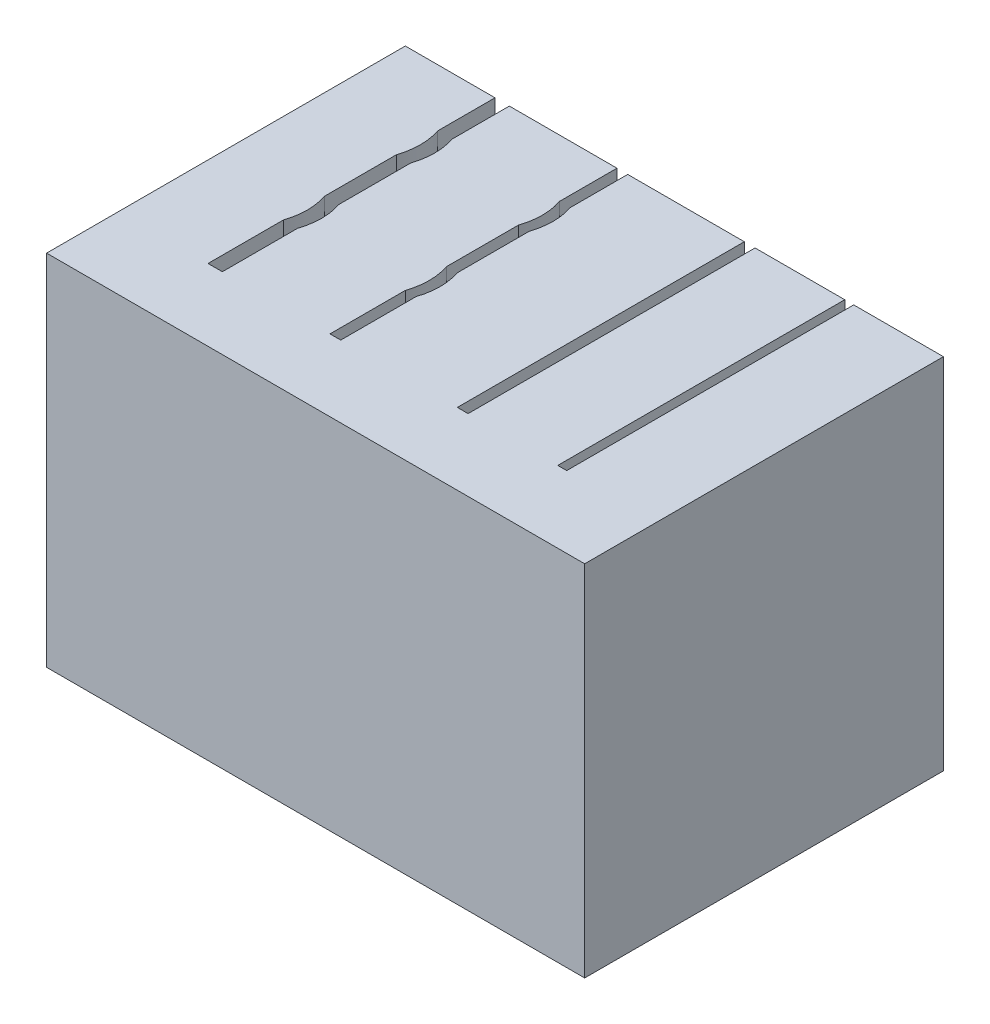
ISO-10303-21;
HEADER;
FILE_DESCRIPTION(('STEP AP214'),'2;1');
FILE_NAME('part.step','',(''),(''),'','','');
FILE_SCHEMA(('AUTOMOTIVE_DESIGN { 1 0 10303 214 1 1 1 1 }'));
ENDSEC;
DATA;
#1=APPLICATION_CONTEXT('core data for automotive mechanical design processes');
#2=APPLICATION_PROTOCOL_DEFINITION('international standard','automotive_design',2000,#1);
#3=PRODUCT_CONTEXT('',#1,'mechanical');
#4=PRODUCT('Part','Part','',(#3));
#5=PRODUCT_RELATED_PRODUCT_CATEGORY('part','',(#4));
#6=PRODUCT_DEFINITION_FORMATION('','',#4);
#7=PRODUCT_DEFINITION_CONTEXT('part definition',#1,'design');
#8=PRODUCT_DEFINITION('design','',#6,#7);
#9=PRODUCT_DEFINITION_SHAPE('','',#8);
#10=(LENGTH_UNIT() NAMED_UNIT(*) SI_UNIT(.MILLI.,.METRE.));
#11=(NAMED_UNIT(*) PLANE_ANGLE_UNIT() SI_UNIT($,.RADIAN.));
#12=(NAMED_UNIT(*) SI_UNIT($,.STERADIAN.) SOLID_ANGLE_UNIT());
#13=UNCERTAINTY_MEASURE_WITH_UNIT(LENGTH_MEASURE(1.E-05),#10,'distance_accuracy_value','');
#14=(GEOMETRIC_REPRESENTATION_CONTEXT(3) GLOBAL_UNCERTAINTY_ASSIGNED_CONTEXT((#13)) GLOBAL_UNIT_ASSIGNED_CONTEXT((#10,
#11,#12)) REPRESENTATION_CONTEXT('',''));
#15=CARTESIAN_POINT('',(0.,0.,0.));
#16=DIRECTION('',(0.,0.,1.));
#17=DIRECTION('',(1.,0.,0.));
#18=AXIS2_PLACEMENT_3D('',#15,#16,#17);
#19=CARTESIAN_POINT('',(-1.3,5.,-5.));
#20=DIRECTION('',(1.,0.,0.));
#21=DIRECTION('',(0.,0.,-1.));
#22=AXIS2_PLACEMENT_3D('',#19,#20,#21);
#23=PLANE('',#22);
#24=DIRECTION('',(0.,0.,-1.));
#25=VECTOR('',#24,1.);
#26=CARTESIAN_POINT('',(-1.3,5.,-5.));
#27=LINE('',#26,#25);
#28=CARTESIAN_POINT('',(-1.3,5.,-3.4));
#29=VERTEX_POINT('',#28);
#30=CARTESIAN_POINT('',(-1.3,5.,-5.));
#31=VERTEX_POINT('',#30);
#32=EDGE_CURVE('E293',#29,#31,#27,.T.);
#33=ORIENTED_EDGE('',*,*,#32,.F.);
#34=DIRECTION('',(0.,1.,0.));
#35=VECTOR('',#34,1.);
#36=CARTESIAN_POINT('',(-1.3,3.84613927930172,-3.4));
#37=LINE('',#36,#35);
#38=CARTESIAN_POINT('',(-1.3,10.,-3.4));
#39=VERTEX_POINT('',#38);
#40=EDGE_CURVE('E54',#29,#39,#37,.T.);
#41=ORIENTED_EDGE('',*,*,#40,.T.);
#42=DIRECTION('',(0.,0.,-1.));
#43=VECTOR('',#42,1.);
#44=CARTESIAN_POINT('',(-1.3,10.,-5.));
#45=LINE('',#44,#43);
#46=CARTESIAN_POINT('',(-1.3,10.,-5.));
#47=VERTEX_POINT('',#46);
#48=EDGE_CURVE('E318',#39,#47,#45,.T.);
#49=ORIENTED_EDGE('',*,*,#48,.T.);
#50=DIRECTION('',(0.,1.,0.));
#51=VECTOR('',#50,1.);
#52=CARTESIAN_POINT('',(-1.3,5.,-5.));
#53=LINE('',#52,#51);
#54=EDGE_CURVE('E321',#31,#47,#53,.T.);
#55=ORIENTED_EDGE('',*,*,#54,.F.);
#56=EDGE_LOOP('',(#33,#41,#49,#55));
#57=FACE_BOUND('',#56,.T.);
#58=ADVANCED_FACE('F39',(#57),#23,.F.);
#59=CARTESIAN_POINT('',(-1.3,10.,-0.25));
#60=VERTEX_POINT('',#59);
#61=CARTESIAN_POINT('',(-1.3,10.,-2.25));
#62=VERTEX_POINT('',#61);
#63=EDGE_CURVE('E317',#60,#62,#45,.T.);
#64=ORIENTED_EDGE('',*,*,#63,.T.);
#65=DIRECTION('',(0.,1.,0.));
#66=VECTOR('',#65,1.);
#67=CARTESIAN_POINT('',(-1.3,3.84613927930172,-2.25));
#68=LINE('',#67,#66);
#69=CARTESIAN_POINT('',(-1.3,5.,-2.25));
#70=VERTEX_POINT('',#69);
#71=EDGE_CURVE('E426',#70,#62,#68,.T.);
#72=ORIENTED_EDGE('',*,*,#71,.F.);
#73=CARTESIAN_POINT('',(-1.3,5.,-0.25));
#74=VERTEX_POINT('',#73);
#75=EDGE_CURVE('E291',#74,#70,#27,.T.);
#76=ORIENTED_EDGE('',*,*,#75,.F.);
#77=DIRECTION('',(0.,1.,0.));
#78=VECTOR('',#77,1.);
#79=CARTESIAN_POINT('',(-1.3,3.84613927930172,-0.25));
#80=LINE('',#79,#78);
#81=EDGE_CURVE('E62',#74,#60,#80,.T.);
#82=ORIENTED_EDGE('',*,*,#81,.T.);
#83=EDGE_LOOP('',(#64,#72,#76,#82));
#84=FACE_BOUND('',#83,.T.);
#85=ADVANCED_FACE('F434',(#84),#23,.F.);
#86=CARTESIAN_POINT('',(-4.6,5.,-5.));
#87=DIRECTION('',(1.,0.,0.));
#88=DIRECTION('',(0.,0.,-1.));
#89=AXIS2_PLACEMENT_3D('',#86,#87,#88);
#90=PLANE('',#89);
#91=DIRECTION('',(0.,0.,-1.));
#92=VECTOR('',#91,1.);
#93=CARTESIAN_POINT('',(-4.6,5.,-5.));
#94=LINE('',#93,#92);
#95=CARTESIAN_POINT('',(-4.6,5.,-0.25));
#96=VERTEX_POINT('',#95);
#97=CARTESIAN_POINT('',(-4.6,5.,-2.25));
#98=VERTEX_POINT('',#97);
#99=EDGE_CURVE('E355',#96,#98,#94,.T.);
#100=ORIENTED_EDGE('',*,*,#99,.F.);
#101=DIRECTION('',(0.,1.,0.));
#102=VECTOR('',#101,1.);
#103=CARTESIAN_POINT('',(-4.6,3.84613927930172,-0.25));
#104=LINE('',#103,#102);
#105=CARTESIAN_POINT('',(-4.6,10.,-0.25));
#106=VERTEX_POINT('',#105);
#107=EDGE_CURVE('E421',#96,#106,#104,.T.);
#108=ORIENTED_EDGE('',*,*,#107,.T.);
#109=DIRECTION('',(0.,0.,-1.));
#110=VECTOR('',#109,1.);
#111=CARTESIAN_POINT('',(-4.6,10.,-5.));
#112=LINE('',#111,#110);
#113=CARTESIAN_POINT('',(-4.6,10.,-2.25));
#114=VERTEX_POINT('',#113);
#115=EDGE_CURVE('E342',#106,#114,#112,.T.);
#116=ORIENTED_EDGE('',*,*,#115,.T.);
#117=DIRECTION('',(0.,1.,0.));
#118=VECTOR('',#117,1.);
#119=CARTESIAN_POINT('',(-4.6,3.84613927930172,-2.25));
#120=LINE('',#119,#118);
#121=EDGE_CURVE('E408',#98,#114,#120,.T.);
#122=ORIENTED_EDGE('',*,*,#121,.F.);
#123=EDGE_LOOP('',(#100,#108,#116,#122));
#124=FACE_BOUND('',#123,.T.);
#125=ADVANCED_FACE('F548',(#124),#90,.F.);
#126=CARTESIAN_POINT('',(-4.6,5.,-3.4));
#127=VERTEX_POINT('',#126);
#128=CARTESIAN_POINT('',(-4.6,5.,-5.));
#129=VERTEX_POINT('',#128);
#130=EDGE_CURVE('E356',#127,#129,#94,.T.);
#131=ORIENTED_EDGE('',*,*,#130,.F.);
#132=DIRECTION('',(0.,1.,0.));
#133=VECTOR('',#132,1.);
#134=CARTESIAN_POINT('',(-4.6,3.84613927930172,-3.4));
#135=LINE('',#134,#133);
#136=CARTESIAN_POINT('',(-4.6,10.,-3.4));
#137=VERTEX_POINT('',#136);
#138=EDGE_CURVE('E405',#127,#137,#135,.T.);
#139=ORIENTED_EDGE('',*,*,#138,.T.);
#140=CARTESIAN_POINT('',(-4.6,10.,-5.));
#141=VERTEX_POINT('',#140);
#142=EDGE_CURVE('E343',#137,#141,#112,.T.);
#143=ORIENTED_EDGE('',*,*,#142,.T.);
#144=DIRECTION('',(0.,1.,0.));
#145=VECTOR('',#144,1.);
#146=CARTESIAN_POINT('',(-4.6,5.,-5.));
#147=LINE('',#146,#145);
#148=EDGE_CURVE('E332',#129,#141,#147,.T.);
#149=ORIENTED_EDGE('',*,*,#148,.F.);
#150=EDGE_LOOP('',(#131,#139,#143,#149));
#151=FACE_BOUND('',#150,.T.);
#152=ADVANCED_FACE('F541',(#151),#90,.F.);
#153=CARTESIAN_POINT('',(-1.6,5.,-5.));
#154=DIRECTION('',(-1.,0.,0.));
#155=DIRECTION('',(0.,0.,1.));
#156=AXIS2_PLACEMENT_3D('',#153,#154,#155);
#157=PLANE('',#156);
#158=DIRECTION('',(0.,0.,1.));
#159=VECTOR('',#158,1.);
#160=CARTESIAN_POINT('',(-1.6,5.,-5.));
#161=LINE('',#160,#159);
#162=CARTESIAN_POINT('',(-1.6,5.,0.900000000000001));
#163=VERTEX_POINT('',#162);
#164=CARTESIAN_POINT('',(-1.6,5.,3.));
#165=VERTEX_POINT('',#164);
#166=EDGE_CURVE('E294',#163,#165,#161,.T.);
#167=ORIENTED_EDGE('',*,*,#166,.F.);
#168=DIRECTION('',(0.,1.,0.));
#169=VECTOR('',#168,1.);
#170=CARTESIAN_POINT('',(-1.6,3.84613927930172,0.9));
#171=LINE('',#170,#169);
#172=CARTESIAN_POINT('',(-1.6,10.,0.900000000000001));
#173=VERTEX_POINT('',#172);
#174=EDGE_CURVE('E397',#163,#173,#171,.T.);
#175=ORIENTED_EDGE('',*,*,#174,.T.);
#176=DIRECTION('',(0.,0.,1.));
#177=VECTOR('',#176,1.);
#178=CARTESIAN_POINT('',(-1.6,10.,-5.));
#179=LINE('',#178,#177);
#180=CARTESIAN_POINT('',(-1.6,10.,3.));
#181=VERTEX_POINT('',#180);
#182=EDGE_CURVE('E312',#173,#181,#179,.T.);
#183=ORIENTED_EDGE('',*,*,#182,.T.);
#184=DIRECTION('',(0.,1.,0.));
#185=VECTOR('',#184,1.);
#186=CARTESIAN_POINT('',(-1.6,5.,3.));
#187=LINE('',#186,#185);
#188=EDGE_CURVE('E301',#165,#181,#187,.T.);
#189=ORIENTED_EDGE('',*,*,#188,.F.);
#190=EDGE_LOOP('',(#167,#175,#183,#189));
#191=FACE_BOUND('',#190,.T.);
#192=ADVANCED_FACE('F451',(#191),#157,.F.);
#193=CARTESIAN_POINT('',(-1.6,10.,-2.25));
#194=VERTEX_POINT('',#193);
#195=CARTESIAN_POINT('',(-1.6,10.,-0.25));
#196=VERTEX_POINT('',#195);
#197=EDGE_CURVE('E311',#194,#196,#179,.T.);
#198=ORIENTED_EDGE('',*,*,#197,.T.);
#199=DIRECTION('',(0.,1.,0.));
#200=VECTOR('',#199,1.);
#201=CARTESIAN_POINT('',(-1.6,3.84613927930172,-0.25));
#202=LINE('',#201,#200);
#203=CARTESIAN_POINT('',(-1.6,5.,-0.25));
#204=VERTEX_POINT('',#203);
#205=EDGE_CURVE('E401',#204,#196,#202,.T.);
#206=ORIENTED_EDGE('',*,*,#205,.F.);
#207=CARTESIAN_POINT('',(-1.6,5.,-2.25));
#208=VERTEX_POINT('',#207);
#209=EDGE_CURVE('E442',#208,#204,#161,.T.);
#210=ORIENTED_EDGE('',*,*,#209,.F.);
#211=DIRECTION('',(0.,1.,0.));
#212=VECTOR('',#211,1.);
#213=CARTESIAN_POINT('',(-1.6,3.84613927930172,-2.25));
#214=LINE('',#213,#212);
#215=EDGE_CURVE('E387',#208,#194,#214,.T.);
#216=ORIENTED_EDGE('',*,*,#215,.T.);
#217=EDGE_LOOP('',(#198,#206,#210,#216));
#218=FACE_BOUND('',#217,.T.);
#219=ADVANCED_FACE('F463',(#218),#157,.F.);
#220=CARTESIAN_POINT('',(-5.,5.,-5.));
#221=DIRECTION('',(-1.,0.,0.));
#222=DIRECTION('',(0.,0.,1.));
#223=AXIS2_PLACEMENT_3D('',#220,#221,#222);
#224=PLANE('',#223);
#225=DIRECTION('',(0.,0.,1.));
#226=VECTOR('',#225,1.);
#227=CARTESIAN_POINT('',(-5.,5.,-5.));
#228=LINE('',#227,#226);
#229=CARTESIAN_POINT('',(-5.,5.,0.900000000000001));
#230=VERTEX_POINT('',#229);
#231=CARTESIAN_POINT('',(-5.,5.,3.));
#232=VERTEX_POINT('',#231);
#233=EDGE_CURVE('E341',#230,#232,#228,.T.);
#234=ORIENTED_EDGE('',*,*,#233,.F.);
#235=DIRECTION('',(0.,1.,0.));
#236=VECTOR('',#235,1.);
#237=CARTESIAN_POINT('',(-5.,3.84613927930172,0.9));
#238=LINE('',#237,#236);
#239=CARTESIAN_POINT('',(-5.,10.,0.900000000000001));
#240=VERTEX_POINT('',#239);
#241=EDGE_CURVE('E377',#230,#240,#238,.T.);
#242=ORIENTED_EDGE('',*,*,#241,.T.);
#243=DIRECTION('',(0.,0.,1.));
#244=VECTOR('',#243,1.);
#245=CARTESIAN_POINT('',(-5.,10.,-5.));
#246=LINE('',#245,#244);
#247=CARTESIAN_POINT('',(-5.,10.,3.));
#248=VERTEX_POINT('',#247);
#249=EDGE_CURVE('E310',#240,#248,#246,.T.);
#250=ORIENTED_EDGE('',*,*,#249,.T.);
#251=DIRECTION('',(0.,1.,0.));
#252=VECTOR('',#251,1.);
#253=CARTESIAN_POINT('',(-5.,5.,3.));
#254=LINE('',#253,#252);
#255=EDGE_CURVE('E326',#232,#248,#254,.T.);
#256=ORIENTED_EDGE('',*,*,#255,.F.);
#257=EDGE_LOOP('',(#234,#242,#250,#256));
#258=FACE_BOUND('',#257,.T.);
#259=ADVANCED_FACE('F591',(#258),#224,.F.);
#260=CARTESIAN_POINT('',(-5.,10.,-2.25));
#261=VERTEX_POINT('',#260);
#262=CARTESIAN_POINT('',(-5.,10.,-0.25));
#263=VERTEX_POINT('',#262);
#264=EDGE_CURVE('E349',#261,#263,#246,.T.);
#265=ORIENTED_EDGE('',*,*,#264,.T.);
#266=DIRECTION('',(0.,1.,0.));
#267=VECTOR('',#266,1.);
#268=CARTESIAN_POINT('',(-5.,3.84613927930172,-0.25));
#269=LINE('',#268,#267);
#270=CARTESIAN_POINT('',(-5.,5.,-0.25));
#271=VERTEX_POINT('',#270);
#272=EDGE_CURVE('E381',#271,#263,#269,.T.);
#273=ORIENTED_EDGE('',*,*,#272,.F.);
#274=CARTESIAN_POINT('',(-5.,5.,-2.25));
#275=VERTEX_POINT('',#274);
#276=EDGE_CURVE('E362',#275,#271,#228,.T.);
#277=ORIENTED_EDGE('',*,*,#276,.F.);
#278=DIRECTION('',(0.,1.,0.));
#279=VECTOR('',#278,1.);
#280=CARTESIAN_POINT('',(-5.,3.84613927930172,-2.25));
#281=LINE('',#280,#279);
#282=EDGE_CURVE('E366',#275,#261,#281,.T.);
#283=ORIENTED_EDGE('',*,*,#282,.T.);
#284=EDGE_LOOP('',(#265,#273,#277,#283));
#285=FACE_BOUND('',#284,.T.);
#286=ADVANCED_FACE('F595',(#285),#224,.F.);
#287=CARTESIAN_POINT('',(7.5,10.,-5.));
#288=DIRECTION('',(-1.,0.,0.));
#289=DIRECTION('',(0.,0.,1.));
#290=AXIS2_PLACEMENT_3D('',#287,#288,#289);
#291=PLANE('',#290);
#292=DIRECTION('',(0.,0.,-1.));
#293=VECTOR('',#292,1.);
#294=CARTESIAN_POINT('',(7.5,0.,-5.));
#295=LINE('',#294,#293);
#296=CARTESIAN_POINT('',(7.5,0.,5.));
#297=VERTEX_POINT('',#296);
#298=CARTESIAN_POINT('',(7.5,0.,-5.));
#299=VERTEX_POINT('',#298);
#300=EDGE_CURVE('E337',#297,#299,#295,.T.);
#301=ORIENTED_EDGE('',*,*,#300,.T.);
#302=DIRECTION('',(0.,-1.,0.));
#303=VECTOR('',#302,1.);
#304=CARTESIAN_POINT('',(7.5,10.,-5.));
#305=LINE('',#304,#303);
#306=CARTESIAN_POINT('',(7.5,10.,-5.));
#307=VERTEX_POINT('',#306);
#308=EDGE_CURVE('E11',#307,#299,#305,.T.);
#309=ORIENTED_EDGE('',*,*,#308,.F.);
#310=DIRECTION('',(0.,0.,-1.));
#311=VECTOR('',#310,1.);
#312=CARTESIAN_POINT('',(7.5,10.,-5.));
#313=LINE('',#312,#311);
#314=CARTESIAN_POINT('',(7.5,10.,5.));
#315=VERTEX_POINT('',#314);
#316=EDGE_CURVE('E486',#315,#307,#313,.T.);
#317=ORIENTED_EDGE('',*,*,#316,.F.);
#318=DIRECTION('',(0.,-1.,0.));
#319=VECTOR('',#318,1.);
#320=CARTESIAN_POINT('',(7.5,10.,5.));
#321=LINE('',#320,#319);
#322=EDGE_CURVE('E496',#315,#297,#321,.T.);
#323=ORIENTED_EDGE('',*,*,#322,.T.);
#324=EDGE_LOOP('',(#301,#309,#317,#323));
#325=FACE_BOUND('',#324,.T.);
#326=ADVANCED_FACE('F41',(#325),#291,.F.);
#327=CARTESIAN_POINT('',(-7.5,10.,-5.));
#328=DIRECTION('',(0.,0.,1.));
#329=DIRECTION('',(1.,0.,0.));
#330=AXIS2_PLACEMENT_3D('',#327,#328,#329);
#331=PLANE('',#330);
#332=DIRECTION('',(-1.,0.,0.));
#333=VECTOR('',#332,1.);
#334=CARTESIAN_POINT('',(-7.5,10.,-5.));
#335=LINE('',#334,#333);
#336=CARTESIAN_POINT('',(-5.,10.,-5.));
#337=VERTEX_POINT('',#336);
#338=CARTESIAN_POINT('',(-7.5,10.,-5.));
#339=VERTEX_POINT('',#338);
#340=EDGE_CURVE('E482',#337,#339,#335,.T.);
#341=ORIENTED_EDGE('',*,*,#340,.F.);
#342=DIRECTION('',(0.,1.,0.));
#343=VECTOR('',#342,1.);
#344=CARTESIAN_POINT('',(-5.,5.,-5.));
#345=LINE('',#344,#343);
#346=CARTESIAN_POINT('',(-5.,5.,-5.));
#347=VERTEX_POINT('',#346);
#348=EDGE_CURVE('E335',#347,#337,#345,.T.);
#349=ORIENTED_EDGE('',*,*,#348,.F.);
#350=DIRECTION('',(-1.,0.,0.));
#351=VECTOR('',#350,1.);
#352=CARTESIAN_POINT('',(-5.,5.,-5.));
#353=LINE('',#352,#351);
#354=EDGE_CURVE('E330',#129,#347,#353,.T.);
#355=ORIENTED_EDGE('',*,*,#354,.F.);
#356=ORIENTED_EDGE('',*,*,#148,.T.);
#357=CARTESIAN_POINT('',(-1.6,10.,-5.));
#358=VERTEX_POINT('',#357);
#359=EDGE_CURVE('E475',#358,#141,#335,.T.);
#360=ORIENTED_EDGE('',*,*,#359,.F.);
#361=DIRECTION('',(0.,1.,0.));
#362=VECTOR('',#361,1.);
#363=CARTESIAN_POINT('',(-1.6,5.,-5.));
#364=LINE('',#363,#362);
#365=CARTESIAN_POINT('',(-1.6,5.,-5.));
#366=VERTEX_POINT('',#365);
#367=EDGE_CURVE('E319',#366,#358,#364,.T.);
#368=ORIENTED_EDGE('',*,*,#367,.F.);
#369=DIRECTION('',(-1.,0.,0.));
#370=VECTOR('',#369,1.);
#371=CARTESIAN_POINT('',(-1.6,5.,-5.));
#372=LINE('',#371,#370);
#373=EDGE_CURVE('E297',#31,#366,#372,.T.);
#374=ORIENTED_EDGE('',*,*,#373,.F.);
#375=ORIENTED_EDGE('',*,*,#54,.T.);
#376=CARTESIAN_POINT('',(1.95,10.,-5.));
#377=VERTEX_POINT('',#376);
#378=EDGE_CURVE('E481',#377,#47,#335,.T.);
#379=ORIENTED_EDGE('',*,*,#378,.F.);
#380=DIRECTION('',(0.,1.,0.));
#381=VECTOR('',#380,1.);
#382=CARTESIAN_POINT('',(1.95,5.,-5.));
#383=LINE('',#382,#381);
#384=CARTESIAN_POINT('',(1.95,5.,-5.));
#385=VERTEX_POINT('',#384);
#386=EDGE_CURVE('E928',#385,#377,#383,.T.);
#387=ORIENTED_EDGE('',*,*,#386,.F.);
#388=DIRECTION('',(-1.,0.,0.));
#389=VECTOR('',#388,1.);
#390=CARTESIAN_POINT('',(1.95,5.,-5.));
#391=LINE('',#390,#389);
#392=CARTESIAN_POINT('',(2.25,5.,-5.));
#393=VERTEX_POINT('',#392);
#394=EDGE_CURVE('E897',#393,#385,#391,.T.);
#395=ORIENTED_EDGE('',*,*,#394,.F.);
#396=DIRECTION('',(0.,1.,0.));
#397=VECTOR('',#396,1.);
#398=CARTESIAN_POINT('',(2.25,5.,-5.));
#399=LINE('',#398,#397);
#400=CARTESIAN_POINT('',(2.25,10.,-5.));
#401=VERTEX_POINT('',#400);
#402=EDGE_CURVE('E947',#393,#401,#399,.T.);
#403=ORIENTED_EDGE('',*,*,#402,.T.);
#404=CARTESIAN_POINT('',(4.75,10.,-5.));
#405=VERTEX_POINT('',#404);
#406=EDGE_CURVE('E485',#405,#401,#335,.T.);
#407=ORIENTED_EDGE('',*,*,#406,.F.);
#408=DIRECTION('',(0.,1.,0.));
#409=VECTOR('',#408,1.);
#410=CARTESIAN_POINT('',(4.75,5.,-5.));
#411=LINE('',#410,#409);
#412=CARTESIAN_POINT('',(4.75,5.,-5.));
#413=VERTEX_POINT('',#412);
#414=EDGE_CURVE('E374',#413,#405,#411,.T.);
#415=ORIENTED_EDGE('',*,*,#414,.F.);
#416=DIRECTION('',(-1.,0.,0.));
#417=VECTOR('',#416,1.);
#418=CARTESIAN_POINT('',(4.75,5.,-5.));
#419=LINE('',#418,#417);
#420=CARTESIAN_POINT('',(5.,5.,-5.));
#421=VERTEX_POINT('',#420);
#422=EDGE_CURVE('E913',#421,#413,#419,.T.);
#423=ORIENTED_EDGE('',*,*,#422,.F.);
#424=DIRECTION('',(0.,1.,0.));
#425=VECTOR('',#424,1.);
#426=CARTESIAN_POINT('',(5.,5.,-5.));
#427=LINE('',#426,#425);
#428=CARTESIAN_POINT('',(5.,10.,-5.));
#429=VERTEX_POINT('',#428);
#430=EDGE_CURVE('E916',#421,#429,#427,.T.);
#431=ORIENTED_EDGE('',*,*,#430,.T.);
#432=EDGE_CURVE('E487',#307,#429,#335,.T.);
#433=ORIENTED_EDGE('',*,*,#432,.F.);
#434=ORIENTED_EDGE('',*,*,#308,.T.);
#435=DIRECTION('',(-1.,0.,0.));
#436=VECTOR('',#435,1.);
#437=CARTESIAN_POINT('',(-7.5,0.,-5.));
#438=LINE('',#437,#436);
#439=CARTESIAN_POINT('',(-7.5,0.,-5.));
#440=VERTEX_POINT('',#439);
#441=EDGE_CURVE('E499',#299,#440,#438,.T.);
#442=ORIENTED_EDGE('',*,*,#441,.T.);
#443=DIRECTION('',(0.,-1.,0.));
#444=VECTOR('',#443,1.);
#445=CARTESIAN_POINT('',(-7.5,10.,-5.));
#446=LINE('',#445,#444);
#447=EDGE_CURVE('E47',#339,#440,#446,.T.);
#448=ORIENTED_EDGE('',*,*,#447,.F.);
#449=EDGE_LOOP('',(#341,#349,#355,#356,#360,#368,#374,#375,#379,#387,#395,#403,#407,#415,#423,
#431,#433,#434,#442,#448));
#450=FACE_BOUND('',#449,.T.);
#451=ADVANCED_FACE('F478',(#450),#331,.F.);
#452=CARTESIAN_POINT('',(-7.5,10.,-5.));
#453=DIRECTION('',(1.,0.,0.));
#454=DIRECTION('',(0.,0.,-1.));
#455=AXIS2_PLACEMENT_3D('',#452,#453,#454);
#456=PLANE('',#455);
#457=DIRECTION('',(0.,0.,1.));
#458=VECTOR('',#457,1.);
#459=CARTESIAN_POINT('',(-7.5,0.,-5.));
#460=LINE('',#459,#458);
#461=CARTESIAN_POINT('',(-7.5,0.,5.));
#462=VERTEX_POINT('',#461);
#463=EDGE_CURVE('E501',#440,#462,#460,.T.);
#464=ORIENTED_EDGE('',*,*,#463,.T.);
#465=DIRECTION('',(0.,-1.,0.));
#466=VECTOR('',#465,1.);
#467=CARTESIAN_POINT('',(-7.5,10.,5.));
#468=LINE('',#467,#466);
#469=CARTESIAN_POINT('',(-7.5,10.,5.));
#470=VERTEX_POINT('',#469);
#471=EDGE_CURVE('E507',#470,#462,#468,.T.);
#472=ORIENTED_EDGE('',*,*,#471,.F.);
#473=DIRECTION('',(0.,0.,1.));
#474=VECTOR('',#473,1.);
#475=CARTESIAN_POINT('',(-7.5,10.,-5.));
#476=LINE('',#475,#474);
#477=EDGE_CURVE('E491',#339,#470,#476,.T.);
#478=ORIENTED_EDGE('',*,*,#477,.F.);
#479=ORIENTED_EDGE('',*,*,#447,.T.);
#480=EDGE_LOOP('',(#464,#472,#478,#479));
#481=FACE_BOUND('',#480,.T.);
#482=ADVANCED_FACE('F514',(#481),#456,.F.);
#483=CARTESIAN_POINT('',(-7.5,10.,5.));
#484=DIRECTION('',(0.,0.,-1.));
#485=DIRECTION('',(-1.,0.,0.));
#486=AXIS2_PLACEMENT_3D('',#483,#484,#485);
#487=PLANE('',#486);
#488=DIRECTION('',(1.,0.,0.));
#489=VECTOR('',#488,1.);
#490=CARTESIAN_POINT('',(-7.5,0.,5.));
#491=LINE('',#490,#489);
#492=EDGE_CURVE('E503',#462,#297,#491,.T.);
#493=ORIENTED_EDGE('',*,*,#492,.T.);
#494=ORIENTED_EDGE('',*,*,#322,.F.);
#495=DIRECTION('',(1.,0.,0.));
#496=VECTOR('',#495,1.);
#497=CARTESIAN_POINT('',(-7.5,10.,5.));
#498=LINE('',#497,#496);
#499=EDGE_CURVE('E494',#470,#315,#498,.T.);
#500=ORIENTED_EDGE('',*,*,#499,.F.);
#501=ORIENTED_EDGE('',*,*,#471,.T.);
#502=EDGE_LOOP('',(#493,#494,#500,#501));
#503=FACE_BOUND('',#502,.T.);
#504=ADVANCED_FACE('F522',(#503),#487,.F.);
#505=CARTESIAN_POINT('',(0.,10.,0.));
#506=DIRECTION('',(0.,1.,0.));
#507=DIRECTION('',(0.,0.,1.));
#508=AXIS2_PLACEMENT_3D('',#505,#506,#507);
#509=PLANE('',#508);
#510=CARTESIAN_POINT('',(-3.00568901034157,10.,-2.825));
#511=DIRECTION('',(0.,1.,0.));
#512=DIRECTION('',(0.,0.,-1.));
#513=AXIS2_PLACEMENT_3D('',#510,#511,#512);
#514=CIRCLE('',#513,1.8);
#515=EDGE_CURVE('E412',#62,#39,#514,.T.);
#516=ORIENTED_EDGE('',*,*,#515,.F.);
#517=ORIENTED_EDGE('',*,*,#63,.F.);
#518=CARTESIAN_POINT('',(-3.00568901034157,10.,0.325));
#519=DIRECTION('',(0.,1.,0.));
#520=DIRECTION('',(0.,0.,-1.));
#521=AXIS2_PLACEMENT_3D('',#518,#519,#520);
#522=CIRCLE('',#521,1.8);
#523=CARTESIAN_POINT('',(-1.3,10.,0.9));
#524=VERTEX_POINT('',#523);
#525=EDGE_CURVE('E417',#524,#60,#522,.T.);
#526=ORIENTED_EDGE('',*,*,#525,.F.);
#527=CARTESIAN_POINT('',(-1.3,10.,3.));
#528=VERTEX_POINT('',#527);
#529=EDGE_CURVE('E286',#528,#524,#45,.T.);
#530=ORIENTED_EDGE('',*,*,#529,.F.);
#531=DIRECTION('',(1.,0.,0.));
#532=VECTOR('',#531,1.);
#533=CARTESIAN_POINT('',(-1.6,10.,3.));
#534=LINE('',#533,#532);
#535=EDGE_CURVE('E313',#181,#528,#534,.T.);
#536=ORIENTED_EDGE('',*,*,#535,.F.);
#537=ORIENTED_EDGE('',*,*,#182,.F.);
#538=CARTESIAN_POINT('',(-3.30568901034157,10.,0.325));
#539=DIRECTION('',(0.,1.,0.));
#540=DIRECTION('',(0.,0.,-1.));
#541=AXIS2_PLACEMENT_3D('',#538,#539,#540);
#542=CIRCLE('',#541,1.8);
#543=EDGE_CURVE('E388',#173,#196,#542,.T.);
#544=ORIENTED_EDGE('',*,*,#543,.T.);
#545=ORIENTED_EDGE('',*,*,#197,.F.);
#546=CARTESIAN_POINT('',(-3.30568901034157,10.,-2.825));
#547=DIRECTION('',(0.,1.,0.));
#548=DIRECTION('',(0.,0.,-1.));
#549=AXIS2_PLACEMENT_3D('',#546,#547,#548);
#550=CIRCLE('',#549,1.8);
#551=CARTESIAN_POINT('',(-1.6,10.,-3.4));
#552=VERTEX_POINT('',#551);
#553=EDGE_CURVE('E378',#194,#552,#550,.T.);
#554=ORIENTED_EDGE('',*,*,#553,.T.);
#555=EDGE_CURVE('E308',#358,#552,#179,.T.);
#556=ORIENTED_EDGE('',*,*,#555,.F.);
#557=ORIENTED_EDGE('',*,*,#359,.T.);
#558=ORIENTED_EDGE('',*,*,#142,.F.);
#559=CARTESIAN_POINT('',(-6.30568901034157,10.,-2.825));
#560=DIRECTION('',(0.,1.,0.));
#561=DIRECTION('',(0.,0.,-1.));
#562=AXIS2_PLACEMENT_3D('',#559,#560,#561);
#563=CIRCLE('',#562,1.8);
#564=EDGE_CURVE('E409',#114,#137,#563,.T.);
#565=ORIENTED_EDGE('',*,*,#564,.F.);
#566=ORIENTED_EDGE('',*,*,#115,.F.);
#567=CARTESIAN_POINT('',(-6.30568901034157,10.,0.325));
#568=DIRECTION('',(0.,1.,0.));
#569=DIRECTION('',(0.,0.,-1.));
#570=AXIS2_PLACEMENT_3D('',#567,#568,#569);
#571=CIRCLE('',#570,1.8);
#572=CARTESIAN_POINT('',(-4.6,10.,0.9));
#573=VERTEX_POINT('',#572);
#574=EDGE_CURVE('E418',#573,#106,#571,.T.);
#575=ORIENTED_EDGE('',*,*,#574,.F.);
#576=CARTESIAN_POINT('',(-4.6,10.,3.));
#577=VERTEX_POINT('',#576);
#578=EDGE_CURVE('E338',#577,#573,#112,.T.);
#579=ORIENTED_EDGE('',*,*,#578,.F.);
#580=DIRECTION('',(1.,0.,0.));
#581=VECTOR('',#580,1.);
#582=CARTESIAN_POINT('',(-5.,10.,3.));
#583=LINE('',#582,#581);
#584=EDGE_CURVE('E344',#248,#577,#583,.T.);
#585=ORIENTED_EDGE('',*,*,#584,.F.);
#586=ORIENTED_EDGE('',*,*,#249,.F.);
#587=CARTESIAN_POINT('',(-6.70568901034157,10.,0.324999999999997));
#588=DIRECTION('',(0.,1.,0.));
#589=DIRECTION('',(0.,0.,-1.));
#590=AXIS2_PLACEMENT_3D('',#587,#588,#589);
#591=CIRCLE('',#590,1.8);
#592=EDGE_CURVE('E372',#240,#263,#591,.T.);
#593=ORIENTED_EDGE('',*,*,#592,.T.);
#594=ORIENTED_EDGE('',*,*,#264,.F.);
#595=CARTESIAN_POINT('',(-6.70568901034157,10.,-2.825));
#596=DIRECTION('',(0.,1.,0.));
#597=DIRECTION('',(0.,0.,-1.));
#598=AXIS2_PLACEMENT_3D('',#595,#596,#597);
#599=CIRCLE('',#598,1.8);
#600=CARTESIAN_POINT('',(-5.,10.,-3.4));
#601=VERTEX_POINT('',#600);
#602=EDGE_CURVE('E367',#261,#601,#599,.T.);
#603=ORIENTED_EDGE('',*,*,#602,.T.);
#604=EDGE_CURVE('E347',#337,#601,#246,.T.);
#605=ORIENTED_EDGE('',*,*,#604,.F.);
#606=ORIENTED_EDGE('',*,*,#340,.T.);
#607=ORIENTED_EDGE('',*,*,#477,.T.);
#608=ORIENTED_EDGE('',*,*,#499,.T.);
#609=ORIENTED_EDGE('',*,*,#316,.T.);
#610=ORIENTED_EDGE('',*,*,#432,.T.);
#611=DIRECTION('',(0.,0.,-1.));
#612=VECTOR('',#611,1.);
#613=CARTESIAN_POINT('',(5.,10.,-5.));
#614=LINE('',#613,#612);
#615=CARTESIAN_POINT('',(5.,10.,3.));
#616=VERTEX_POINT('',#615);
#617=EDGE_CURVE('E920',#616,#429,#614,.T.);
#618=ORIENTED_EDGE('',*,*,#617,.F.);
#619=DIRECTION('',(1.,0.,0.));
#620=VECTOR('',#619,1.);
#621=CARTESIAN_POINT('',(4.75,10.,3.));
#622=LINE('',#621,#620);
#623=CARTESIAN_POINT('',(4.75,10.,3.));
#624=VERTEX_POINT('',#623);
#625=EDGE_CURVE('E922',#624,#616,#622,.T.);
#626=ORIENTED_EDGE('',*,*,#625,.F.);
#627=DIRECTION('',(0.,0.,1.));
#628=VECTOR('',#627,1.);
#629=CARTESIAN_POINT('',(4.75,10.,-5.));
#630=LINE('',#629,#628);
#631=EDGE_CURVE('E926',#405,#624,#630,.T.);
#632=ORIENTED_EDGE('',*,*,#631,.F.);
#633=ORIENTED_EDGE('',*,*,#406,.T.);
#634=DIRECTION('',(0.,0.,-1.));
#635=VECTOR('',#634,1.);
#636=CARTESIAN_POINT('',(2.25,10.,-5.));
#637=LINE('',#636,#635);
#638=CARTESIAN_POINT('',(2.25,10.,3.));
#639=VERTEX_POINT('',#638);
#640=EDGE_CURVE('E893',#639,#401,#637,.T.);
#641=ORIENTED_EDGE('',*,*,#640,.F.);
#642=DIRECTION('',(1.,0.,0.));
#643=VECTOR('',#642,1.);
#644=CARTESIAN_POINT('',(1.95,10.,3.));
#645=LINE('',#644,#643);
#646=CARTESIAN_POINT('',(1.95,10.,3.));
#647=VERTEX_POINT('',#646);
#648=EDGE_CURVE('E890',#647,#639,#645,.T.);
#649=ORIENTED_EDGE('',*,*,#648,.F.);
#650=DIRECTION('',(0.,0.,1.));
#651=VECTOR('',#650,1.);
#652=CARTESIAN_POINT('',(1.95,10.,-5.));
#653=LINE('',#652,#651);
#654=EDGE_CURVE('E322',#377,#647,#653,.T.);
#655=ORIENTED_EDGE('',*,*,#654,.F.);
#656=ORIENTED_EDGE('',*,*,#378,.T.);
#657=ORIENTED_EDGE('',*,*,#48,.F.);
#658=EDGE_LOOP('',(#516,#517,#526,#530,#536,#537,#544,#545,#554,#556,#557,#558,#565,#566,#575,
#579,#585,#586,#593,#594,#603,#605,#606,#607,#608,#609,#610,#618,#626,#632,#633,#641,#649,#655,
#656,#657));
#659=FACE_BOUND('',#658,.T.);
#660=ADVANCED_FACE('F438',(#659),#509,.T.);
#661=CARTESIAN_POINT('',(0.,0.,0.));
#662=DIRECTION('',(0.,1.,0.));
#663=DIRECTION('',(0.,0.,1.));
#664=AXIS2_PLACEMENT_3D('',#661,#662,#663);
#665=PLANE('',#664);
#666=ORIENTED_EDGE('',*,*,#300,.F.);
#667=ORIENTED_EDGE('',*,*,#492,.F.);
#668=ORIENTED_EDGE('',*,*,#463,.F.);
#669=ORIENTED_EDGE('',*,*,#441,.F.);
#670=EDGE_LOOP('',(#666,#667,#668,#669));
#671=FACE_BOUND('',#670,.T.);
#672=ADVANCED_FACE('F519',(#671),#665,.F.);
#673=CARTESIAN_POINT('',(4.75,5.,-5.));
#674=DIRECTION('',(-1.,0.,0.));
#675=DIRECTION('',(0.,0.,1.));
#676=AXIS2_PLACEMENT_3D('',#673,#674,#675);
#677=PLANE('',#676);
#678=ORIENTED_EDGE('',*,*,#631,.T.);
#679=DIRECTION('',(0.,1.,0.));
#680=VECTOR('',#679,1.);
#681=CARTESIAN_POINT('',(4.75,5.,3.));
#682=LINE('',#681,#680);
#683=CARTESIAN_POINT('',(4.75,5.,3.));
#684=VERTEX_POINT('',#683);
#685=EDGE_CURVE('E910',#684,#624,#682,.T.);
#686=ORIENTED_EDGE('',*,*,#685,.F.);
#687=DIRECTION('',(0.,0.,1.));
#688=VECTOR('',#687,1.);
#689=CARTESIAN_POINT('',(4.75,5.,-5.));
#690=LINE('',#689,#688);
#691=EDGE_CURVE('E923',#413,#684,#690,.T.);
#692=ORIENTED_EDGE('',*,*,#691,.F.);
#693=ORIENTED_EDGE('',*,*,#414,.T.);
#694=EDGE_LOOP('',(#678,#686,#692,#693));
#695=FACE_BOUND('',#694,.T.);
#696=ADVANCED_FACE('F625',(#695),#677,.F.);
#697=CARTESIAN_POINT('',(5.,5.,-5.));
#698=DIRECTION('',(1.,0.,0.));
#699=DIRECTION('',(0.,0.,-1.));
#700=AXIS2_PLACEMENT_3D('',#697,#698,#699);
#701=PLANE('',#700);
#702=ORIENTED_EDGE('',*,*,#617,.T.);
#703=ORIENTED_EDGE('',*,*,#430,.F.);
#704=DIRECTION('',(0.,0.,-1.));
#705=VECTOR('',#704,1.);
#706=CARTESIAN_POINT('',(5.,5.,-5.));
#707=LINE('',#706,#705);
#708=CARTESIAN_POINT('',(5.,5.,3.));
#709=VERTEX_POINT('',#708);
#710=EDGE_CURVE('E931',#709,#421,#707,.T.);
#711=ORIENTED_EDGE('',*,*,#710,.F.);
#712=DIRECTION('',(0.,1.,0.));
#713=VECTOR('',#712,1.);
#714=CARTESIAN_POINT('',(5.,5.,3.));
#715=LINE('',#714,#713);
#716=EDGE_CURVE('E914',#709,#616,#715,.T.);
#717=ORIENTED_EDGE('',*,*,#716,.T.);
#718=EDGE_LOOP('',(#702,#703,#711,#717));
#719=FACE_BOUND('',#718,.T.);
#720=ADVANCED_FACE('F628',(#719),#701,.F.);
#721=CARTESIAN_POINT('',(4.75,5.,3.));
#722=DIRECTION('',(0.,0.,1.));
#723=DIRECTION('',(1.,0.,0.));
#724=AXIS2_PLACEMENT_3D('',#721,#722,#723);
#725=PLANE('',#724);
#726=ORIENTED_EDGE('',*,*,#625,.T.);
#727=ORIENTED_EDGE('',*,*,#716,.F.);
#728=DIRECTION('',(1.,0.,0.));
#729=VECTOR('',#728,1.);
#730=CARTESIAN_POINT('',(4.75,5.,3.));
#731=LINE('',#730,#729);
#732=EDGE_CURVE('E934',#684,#709,#731,.T.);
#733=ORIENTED_EDGE('',*,*,#732,.F.);
#734=ORIENTED_EDGE('',*,*,#685,.T.);
#735=EDGE_LOOP('',(#726,#727,#733,#734));
#736=FACE_BOUND('',#735,.T.);
#737=ADVANCED_FACE('F630',(#736),#725,.F.);
#738=CARTESIAN_POINT('',(0.,5.,0.));
#739=DIRECTION('',(0.,1.,0.));
#740=DIRECTION('',(0.,0.,1.));
#741=AXIS2_PLACEMENT_3D('',#738,#739,#740);
#742=PLANE('',#741);
#743=ORIENTED_EDGE('',*,*,#691,.T.);
#744=ORIENTED_EDGE('',*,*,#732,.T.);
#745=ORIENTED_EDGE('',*,*,#710,.T.);
#746=ORIENTED_EDGE('',*,*,#422,.T.);
#747=EDGE_LOOP('',(#743,#744,#745,#746));
#748=FACE_BOUND('',#747,.T.);
#749=ADVANCED_FACE('F617',(#748),#742,.T.);
#750=CARTESIAN_POINT('',(1.95,5.,-5.));
#751=DIRECTION('',(-1.,0.,0.));
#752=DIRECTION('',(0.,0.,1.));
#753=AXIS2_PLACEMENT_3D('',#750,#751,#752);
#754=PLANE('',#753);
#755=ORIENTED_EDGE('',*,*,#654,.T.);
#756=DIRECTION('',(0.,1.,0.));
#757=VECTOR('',#756,1.);
#758=CARTESIAN_POINT('',(1.95,5.,3.));
#759=LINE('',#758,#757);
#760=CARTESIAN_POINT('',(1.95,5.,3.));
#761=VERTEX_POINT('',#760);
#762=EDGE_CURVE('E901',#761,#647,#759,.T.);
#763=ORIENTED_EDGE('',*,*,#762,.F.);
#764=DIRECTION('',(0.,0.,1.));
#765=VECTOR('',#764,1.);
#766=CARTESIAN_POINT('',(1.95,5.,-5.));
#767=LINE('',#766,#765);
#768=EDGE_CURVE('E907',#385,#761,#767,.T.);
#769=ORIENTED_EDGE('',*,*,#768,.F.);
#770=ORIENTED_EDGE('',*,*,#386,.T.);
#771=EDGE_LOOP('',(#755,#763,#769,#770));
#772=FACE_BOUND('',#771,.T.);
#773=ADVANCED_FACE('F613',(#772),#754,.F.);
#774=CARTESIAN_POINT('',(2.25,5.,-5.));
#775=DIRECTION('',(1.,0.,0.));
#776=DIRECTION('',(0.,0.,-1.));
#777=AXIS2_PLACEMENT_3D('',#774,#775,#776);
#778=PLANE('',#777);
#779=ORIENTED_EDGE('',*,*,#640,.T.);
#780=ORIENTED_EDGE('',*,*,#402,.F.);
#781=DIRECTION('',(0.,0.,-1.));
#782=VECTOR('',#781,1.);
#783=CARTESIAN_POINT('',(2.25,5.,-5.));
#784=LINE('',#783,#782);
#785=CARTESIAN_POINT('',(2.25,5.,3.));
#786=VERTEX_POINT('',#785);
#787=EDGE_CURVE('E900',#786,#393,#784,.T.);
#788=ORIENTED_EDGE('',*,*,#787,.F.);
#789=DIRECTION('',(0.,1.,0.));
#790=VECTOR('',#789,1.);
#791=CARTESIAN_POINT('',(2.25,5.,3.));
#792=LINE('',#791,#790);
#793=EDGE_CURVE('E951',#786,#639,#792,.T.);
#794=ORIENTED_EDGE('',*,*,#793,.T.);
#795=EDGE_LOOP('',(#779,#780,#788,#794));
#796=FACE_BOUND('',#795,.T.);
#797=ADVANCED_FACE('F616',(#796),#778,.F.);
#798=CARTESIAN_POINT('',(1.95,5.,3.));
#799=DIRECTION('',(0.,0.,1.));
#800=DIRECTION('',(1.,0.,0.));
#801=AXIS2_PLACEMENT_3D('',#798,#799,#800);
#802=PLANE('',#801);
#803=ORIENTED_EDGE('',*,*,#648,.T.);
#804=ORIENTED_EDGE('',*,*,#793,.F.);
#805=DIRECTION('',(1.,0.,0.));
#806=VECTOR('',#805,1.);
#807=CARTESIAN_POINT('',(1.95,5.,3.));
#808=LINE('',#807,#806);
#809=EDGE_CURVE('E904',#761,#786,#808,.T.);
#810=ORIENTED_EDGE('',*,*,#809,.F.);
#811=ORIENTED_EDGE('',*,*,#762,.T.);
#812=EDGE_LOOP('',(#803,#804,#810,#811));
#813=FACE_BOUND('',#812,.T.);
#814=ADVANCED_FACE('F585',(#813),#802,.F.);
#815=CARTESIAN_POINT('',(0.,5.,0.));
#816=DIRECTION('',(0.,1.,0.));
#817=DIRECTION('',(0.,0.,1.));
#818=AXIS2_PLACEMENT_3D('',#815,#816,#817);
#819=PLANE('',#818);
#820=ORIENTED_EDGE('',*,*,#768,.T.);
#821=ORIENTED_EDGE('',*,*,#809,.T.);
#822=ORIENTED_EDGE('',*,*,#787,.T.);
#823=ORIENTED_EDGE('',*,*,#394,.T.);
#824=EDGE_LOOP('',(#820,#821,#822,#823));
#825=FACE_BOUND('',#824,.T.);
#826=ADVANCED_FACE('F578',(#825),#819,.T.);
#827=ORIENTED_EDGE('',*,*,#555,.T.);
#828=DIRECTION('',(0.,1.,0.));
#829=VECTOR('',#828,1.);
#830=CARTESIAN_POINT('',(-1.6,3.84613927930172,-3.4));
#831=LINE('',#830,#829);
#832=CARTESIAN_POINT('',(-1.6,5.,-3.4));
#833=VERTEX_POINT('',#832);
#834=EDGE_CURVE('E391',#833,#552,#831,.T.);
#835=ORIENTED_EDGE('',*,*,#834,.F.);
#836=EDGE_CURVE('E440',#366,#833,#161,.T.);
#837=ORIENTED_EDGE('',*,*,#836,.F.);
#838=ORIENTED_EDGE('',*,*,#367,.T.);
#839=EDGE_LOOP('',(#827,#835,#837,#838));
#840=FACE_BOUND('',#839,.T.);
#841=ADVANCED_FACE('F471',(#840),#157,.F.);
#842=ORIENTED_EDGE('',*,*,#529,.T.);
#843=DIRECTION('',(0.,1.,0.));
#844=VECTOR('',#843,1.);
#845=CARTESIAN_POINT('',(-1.3,3.84613927930172,0.9));
#846=LINE('',#845,#844);
#847=CARTESIAN_POINT('',(-1.3,5.,0.9));
#848=VERTEX_POINT('',#847);
#849=EDGE_CURVE('E272',#848,#524,#846,.T.);
#850=ORIENTED_EDGE('',*,*,#849,.F.);
#851=CARTESIAN_POINT('',(-1.3,5.,3.));
#852=VERTEX_POINT('',#851);
#853=EDGE_CURVE('E283',#852,#848,#27,.T.);
#854=ORIENTED_EDGE('',*,*,#853,.F.);
#855=DIRECTION('',(0.,1.,0.));
#856=VECTOR('',#855,1.);
#857=CARTESIAN_POINT('',(-1.3,5.,3.));
#858=LINE('',#857,#856);
#859=EDGE_CURVE('E305',#852,#528,#858,.T.);
#860=ORIENTED_EDGE('',*,*,#859,.T.);
#861=EDGE_LOOP('',(#842,#850,#854,#860));
#862=FACE_BOUND('',#861,.T.);
#863=ADVANCED_FACE('F282',(#862),#23,.F.);
#864=CARTESIAN_POINT('',(-1.6,5.,3.));
#865=DIRECTION('',(0.,0.,1.));
#866=DIRECTION('',(1.,0.,0.));
#867=AXIS2_PLACEMENT_3D('',#864,#865,#866);
#868=PLANE('',#867);
#869=ORIENTED_EDGE('',*,*,#535,.T.);
#870=ORIENTED_EDGE('',*,*,#859,.F.);
#871=DIRECTION('',(1.,0.,0.));
#872=VECTOR('',#871,1.);
#873=CARTESIAN_POINT('',(-1.6,5.,3.));
#874=LINE('',#873,#872);
#875=EDGE_CURVE('E290',#165,#852,#874,.T.);
#876=ORIENTED_EDGE('',*,*,#875,.F.);
#877=ORIENTED_EDGE('',*,*,#188,.T.);
#878=EDGE_LOOP('',(#869,#870,#876,#877));
#879=FACE_BOUND('',#878,.T.);
#880=ADVANCED_FACE('F455',(#879),#868,.F.);
#881=CARTESIAN_POINT('',(0.,5.,0.));
#882=DIRECTION('',(0.,1.,0.));
#883=DIRECTION('',(0.,0.,1.));
#884=AXIS2_PLACEMENT_3D('',#881,#882,#883);
#885=PLANE('',#884);
#886=CARTESIAN_POINT('',(-3.30568901034157,5.,0.325));
#887=DIRECTION('',(0.,1.,0.));
#888=DIRECTION('',(0.,0.,1.));
#889=AXIS2_PLACEMENT_3D('',#886,#887,#888);
#890=CIRCLE('',#889,1.8);
#891=EDGE_CURVE('E395',#204,#163,#890,.F.);
#892=ORIENTED_EDGE('',*,*,#891,.T.);
#893=ORIENTED_EDGE('',*,*,#166,.T.);
#894=ORIENTED_EDGE('',*,*,#875,.T.);
#895=ORIENTED_EDGE('',*,*,#853,.T.);
#896=CARTESIAN_POINT('',(-3.00568901034157,5.,0.325));
#897=DIRECTION('',(0.,1.,0.));
#898=DIRECTION('',(0.,0.,1.));
#899=AXIS2_PLACEMENT_3D('',#896,#897,#898);
#900=CIRCLE('',#899,1.8);
#901=EDGE_CURVE('E269',#74,#848,#900,.F.);
#902=ORIENTED_EDGE('',*,*,#901,.F.);
#903=ORIENTED_EDGE('',*,*,#75,.T.);
#904=CARTESIAN_POINT('',(-3.00568901034157,5.,-2.825));
#905=DIRECTION('',(0.,1.,0.));
#906=DIRECTION('',(0.,0.,1.));
#907=AXIS2_PLACEMENT_3D('',#904,#905,#906);
#908=CIRCLE('',#907,1.8);
#909=EDGE_CURVE('E420',#29,#70,#908,.F.);
#910=ORIENTED_EDGE('',*,*,#909,.F.);
#911=ORIENTED_EDGE('',*,*,#32,.T.);
#912=ORIENTED_EDGE('',*,*,#373,.T.);
#913=ORIENTED_EDGE('',*,*,#836,.T.);
#914=CARTESIAN_POINT('',(-3.30568901034157,5.,-2.825));
#915=DIRECTION('',(0.,1.,0.));
#916=DIRECTION('',(0.,0.,1.));
#917=AXIS2_PLACEMENT_3D('',#914,#915,#916);
#918=CIRCLE('',#917,1.8);
#919=EDGE_CURVE('E385',#833,#208,#918,.F.);
#920=ORIENTED_EDGE('',*,*,#919,.T.);
#921=ORIENTED_EDGE('',*,*,#209,.T.);
#922=EDGE_LOOP('',(#892,#893,#894,#895,#902,#903,#910,#911,#912,#913,#920,#921));
#923=FACE_BOUND('',#922,.T.);
#924=ADVANCED_FACE('F288',(#923),#885,.T.);
#925=ORIENTED_EDGE('',*,*,#604,.T.);
#926=DIRECTION('',(0.,1.,0.));
#927=VECTOR('',#926,1.);
#928=CARTESIAN_POINT('',(-5.,3.84613927930172,-3.4));
#929=LINE('',#928,#927);
#930=CARTESIAN_POINT('',(-5.,5.,-3.4));
#931=VERTEX_POINT('',#930);
#932=EDGE_CURVE('E363',#931,#601,#929,.T.);
#933=ORIENTED_EDGE('',*,*,#932,.F.);
#934=EDGE_CURVE('E360',#347,#931,#228,.T.);
#935=ORIENTED_EDGE('',*,*,#934,.F.);
#936=ORIENTED_EDGE('',*,*,#348,.T.);
#937=EDGE_LOOP('',(#925,#933,#935,#936));
#938=FACE_BOUND('',#937,.T.);
#939=ADVANCED_FACE('F532',(#938),#224,.F.);
#940=ORIENTED_EDGE('',*,*,#578,.T.);
#941=DIRECTION('',(0.,1.,0.));
#942=VECTOR('',#941,1.);
#943=CARTESIAN_POINT('',(-4.6,3.84613927930172,0.9));
#944=LINE('',#943,#942);
#945=CARTESIAN_POINT('',(-4.6,5.,0.9));
#946=VERTEX_POINT('',#945);
#947=EDGE_CURVE('E416',#946,#573,#944,.T.);
#948=ORIENTED_EDGE('',*,*,#947,.F.);
#949=CARTESIAN_POINT('',(-4.6,5.,3.));
#950=VERTEX_POINT('',#949);
#951=EDGE_CURVE('E352',#950,#946,#94,.T.);
#952=ORIENTED_EDGE('',*,*,#951,.F.);
#953=DIRECTION('',(0.,1.,0.));
#954=VECTOR('',#953,1.);
#955=CARTESIAN_POINT('',(-4.6,5.,3.));
#956=LINE('',#955,#954);
#957=EDGE_CURVE('E329',#950,#577,#956,.T.);
#958=ORIENTED_EDGE('',*,*,#957,.T.);
#959=EDGE_LOOP('',(#940,#948,#952,#958));
#960=FACE_BOUND('',#959,.T.);
#961=ADVANCED_FACE('F602',(#960),#90,.F.);
#962=CARTESIAN_POINT('',(-5.,5.,3.));
#963=DIRECTION('',(0.,0.,1.));
#964=DIRECTION('',(1.,0.,0.));
#965=AXIS2_PLACEMENT_3D('',#962,#963,#964);
#966=PLANE('',#965);
#967=ORIENTED_EDGE('',*,*,#584,.T.);
#968=ORIENTED_EDGE('',*,*,#957,.F.);
#969=DIRECTION('',(1.,0.,0.));
#970=VECTOR('',#969,1.);
#971=CARTESIAN_POINT('',(-5.,5.,3.));
#972=LINE('',#971,#970);
#973=EDGE_CURVE('E357',#232,#950,#972,.T.);
#974=ORIENTED_EDGE('',*,*,#973,.F.);
#975=ORIENTED_EDGE('',*,*,#255,.T.);
#976=EDGE_LOOP('',(#967,#968,#974,#975));
#977=FACE_BOUND('',#976,.T.);
#978=ADVANCED_FACE('F607',(#977),#966,.F.);
#979=CARTESIAN_POINT('',(0.,5.,0.));
#980=DIRECTION('',(0.,1.,0.));
#981=DIRECTION('',(0.,0.,1.));
#982=AXIS2_PLACEMENT_3D('',#979,#980,#981);
#983=PLANE('',#982);
#984=CARTESIAN_POINT('',(-6.70568901034157,5.,0.324999999999997));
#985=DIRECTION('',(0.,1.,0.));
#986=DIRECTION('',(0.,0.,1.));
#987=AXIS2_PLACEMENT_3D('',#984,#985,#986);
#988=CIRCLE('',#987,1.8);
#989=EDGE_CURVE('E375',#271,#230,#988,.F.);
#990=ORIENTED_EDGE('',*,*,#989,.T.);
#991=ORIENTED_EDGE('',*,*,#233,.T.);
#992=ORIENTED_EDGE('',*,*,#973,.T.);
#993=ORIENTED_EDGE('',*,*,#951,.T.);
#994=CARTESIAN_POINT('',(-6.30568901034157,5.,0.325));
#995=DIRECTION('',(0.,1.,0.));
#996=DIRECTION('',(0.,0.,1.));
#997=AXIS2_PLACEMENT_3D('',#994,#995,#996);
#998=CIRCLE('',#997,1.8);
#999=EDGE_CURVE('E414',#96,#946,#998,.F.);
#1000=ORIENTED_EDGE('',*,*,#999,.F.);
#1001=ORIENTED_EDGE('',*,*,#99,.T.);
#1002=CARTESIAN_POINT('',(-6.30568901034157,5.,-2.825));
#1003=DIRECTION('',(0.,1.,0.));
#1004=DIRECTION('',(0.,0.,1.));
#1005=AXIS2_PLACEMENT_3D('',#1002,#1003,#1004);
#1006=CIRCLE('',#1005,1.8);
#1007=EDGE_CURVE('E398',#127,#98,#1006,.F.);
#1008=ORIENTED_EDGE('',*,*,#1007,.F.);
#1009=ORIENTED_EDGE('',*,*,#130,.T.);
#1010=ORIENTED_EDGE('',*,*,#354,.T.);
#1011=ORIENTED_EDGE('',*,*,#934,.T.);
#1012=CARTESIAN_POINT('',(-6.70568901034157,5.,-2.825));
#1013=DIRECTION('',(0.,1.,0.));
#1014=DIRECTION('',(0.,0.,1.));
#1015=AXIS2_PLACEMENT_3D('',#1012,#1013,#1014);
#1016=CIRCLE('',#1015,1.8);
#1017=EDGE_CURVE('E369',#931,#275,#1016,.F.);
#1018=ORIENTED_EDGE('',*,*,#1017,.T.);
#1019=ORIENTED_EDGE('',*,*,#276,.T.);
#1020=EDGE_LOOP('',(#990,#991,#992,#993,#1000,#1001,#1008,#1009,#1010,#1011,#1018,#1019));
#1021=FACE_BOUND('',#1020,.T.);
#1022=ADVANCED_FACE('F536',(#1021),#983,.T.);
#1023=CARTESIAN_POINT('',(-6.70568901034157,3.84613927930172,-2.825));
#1024=DIRECTION('',(0.,1.,0.));
#1025=DIRECTION('',(0.,0.,1.));
#1026=AXIS2_PLACEMENT_3D('',#1023,#1024,#1025);
#1027=CYLINDRICAL_SURFACE('',#1026,1.8);
#1028=ORIENTED_EDGE('',*,*,#1017,.F.);
#1029=ORIENTED_EDGE('',*,*,#932,.T.);
#1030=ORIENTED_EDGE('',*,*,#602,.F.);
#1031=ORIENTED_EDGE('',*,*,#282,.F.);
#1032=EDGE_LOOP('',(#1028,#1029,#1030,#1031));
#1033=FACE_BOUND('',#1032,.T.);
#1034=ADVANCED_FACE('F769',(#1033),#1027,.T.);
#1035=CARTESIAN_POINT('',(-6.70568901034157,3.84613927930172,0.324999999999997));
#1036=DIRECTION('',(0.,1.,0.));
#1037=DIRECTION('',(0.,0.,1.));
#1038=AXIS2_PLACEMENT_3D('',#1035,#1036,#1037);
#1039=CYLINDRICAL_SURFACE('',#1038,1.8);
#1040=ORIENTED_EDGE('',*,*,#989,.F.);
#1041=ORIENTED_EDGE('',*,*,#272,.T.);
#1042=ORIENTED_EDGE('',*,*,#592,.F.);
#1043=ORIENTED_EDGE('',*,*,#241,.F.);
#1044=EDGE_LOOP('',(#1040,#1041,#1042,#1043));
#1045=FACE_BOUND('',#1044,.T.);
#1046=ADVANCED_FACE('F810',(#1045),#1039,.T.);
#1047=CARTESIAN_POINT('',(-3.30568901034157,3.84613927930172,-2.825));
#1048=DIRECTION('',(0.,1.,0.));
#1049=DIRECTION('',(0.,0.,1.));
#1050=AXIS2_PLACEMENT_3D('',#1047,#1048,#1049);
#1051=CYLINDRICAL_SURFACE('',#1050,1.8);
#1052=ORIENTED_EDGE('',*,*,#919,.F.);
#1053=ORIENTED_EDGE('',*,*,#834,.T.);
#1054=ORIENTED_EDGE('',*,*,#553,.F.);
#1055=ORIENTED_EDGE('',*,*,#215,.F.);
#1056=EDGE_LOOP('',(#1052,#1053,#1054,#1055));
#1057=FACE_BOUND('',#1056,.T.);
#1058=ADVANCED_FACE('F469',(#1057),#1051,.T.);
#1059=CARTESIAN_POINT('',(-3.30568901034157,3.84613927930172,0.325));
#1060=DIRECTION('',(0.,1.,0.));
#1061=DIRECTION('',(0.,0.,1.));
#1062=AXIS2_PLACEMENT_3D('',#1059,#1060,#1061);
#1063=CYLINDRICAL_SURFACE('',#1062,1.8);
#1064=ORIENTED_EDGE('',*,*,#891,.F.);
#1065=ORIENTED_EDGE('',*,*,#205,.T.);
#1066=ORIENTED_EDGE('',*,*,#543,.F.);
#1067=ORIENTED_EDGE('',*,*,#174,.F.);
#1068=EDGE_LOOP('',(#1064,#1065,#1066,#1067));
#1069=FACE_BOUND('',#1068,.T.);
#1070=ADVANCED_FACE('F459',(#1069),#1063,.T.);
#1071=CARTESIAN_POINT('',(-6.30568901034157,3.84613927930172,-2.825));
#1072=DIRECTION('',(0.,1.,0.));
#1073=DIRECTION('',(0.,0.,1.));
#1074=AXIS2_PLACEMENT_3D('',#1071,#1072,#1073);
#1075=CYLINDRICAL_SURFACE('',#1074,1.8);
#1076=ORIENTED_EDGE('',*,*,#1007,.T.);
#1077=ORIENTED_EDGE('',*,*,#121,.T.);
#1078=ORIENTED_EDGE('',*,*,#564,.T.);
#1079=ORIENTED_EDGE('',*,*,#138,.F.);
#1080=EDGE_LOOP('',(#1076,#1077,#1078,#1079));
#1081=FACE_BOUND('',#1080,.T.);
#1082=ADVANCED_FACE('F552',(#1081),#1075,.F.);
#1083=CARTESIAN_POINT('',(-6.30568901034157,3.84613927930172,0.325));
#1084=DIRECTION('',(0.,1.,0.));
#1085=DIRECTION('',(0.,0.,1.));
#1086=AXIS2_PLACEMENT_3D('',#1083,#1084,#1085);
#1087=CYLINDRICAL_SURFACE('',#1086,1.8);
#1088=ORIENTED_EDGE('',*,*,#999,.T.);
#1089=ORIENTED_EDGE('',*,*,#947,.T.);
#1090=ORIENTED_EDGE('',*,*,#574,.T.);
#1091=ORIENTED_EDGE('',*,*,#107,.F.);
#1092=EDGE_LOOP('',(#1088,#1089,#1090,#1091));
#1093=FACE_BOUND('',#1092,.T.);
#1094=ADVANCED_FACE('F554',(#1093),#1087,.F.);
#1095=CARTESIAN_POINT('',(-3.00568901034157,3.84613927930172,0.325));
#1096=DIRECTION('',(0.,1.,0.));
#1097=DIRECTION('',(0.,0.,1.));
#1098=AXIS2_PLACEMENT_3D('',#1095,#1096,#1097);
#1099=CYLINDRICAL_SURFACE('',#1098,1.8);
#1100=ORIENTED_EDGE('',*,*,#901,.T.);
#1101=ORIENTED_EDGE('',*,*,#849,.T.);
#1102=ORIENTED_EDGE('',*,*,#525,.T.);
#1103=ORIENTED_EDGE('',*,*,#81,.F.);
#1104=EDGE_LOOP('',(#1100,#1101,#1102,#1103));
#1105=FACE_BOUND('',#1104,.T.);
#1106=ADVANCED_FACE('F271',(#1105),#1099,.F.);
#1107=CARTESIAN_POINT('',(-3.00568901034157,3.84613927930172,-2.825));
#1108=DIRECTION('',(0.,1.,0.));
#1109=DIRECTION('',(0.,0.,1.));
#1110=AXIS2_PLACEMENT_3D('',#1107,#1108,#1109);
#1111=CYLINDRICAL_SURFACE('',#1110,1.8);
#1112=ORIENTED_EDGE('',*,*,#909,.T.);
#1113=ORIENTED_EDGE('',*,*,#71,.T.);
#1114=ORIENTED_EDGE('',*,*,#515,.T.);
#1115=ORIENTED_EDGE('',*,*,#40,.F.);
#1116=EDGE_LOOP('',(#1112,#1113,#1114,#1115));
#1117=FACE_BOUND('',#1116,.T.);
#1118=ADVANCED_FACE('F871',(#1117),#1111,.F.);
#1119=CLOSED_SHELL('',(#58,#85,#125,#152,#192,#219,#259,#286,#326,#451,#482,#504,#660,#672,#696,
#720,#737,#749,#773,#797,#814,#826,#841,#863,#880,#924,#939,#961,#978,#1022,#1034,#1046,#1058,
#1070,#1082,#1094,#1106,#1118));
#1120=MANIFOLD_SOLID_BREP('B2',#1119);
#1121=ADVANCED_BREP_SHAPE_REPRESENTATION('',(#18,#1120),#14);
#1122=SHAPE_DEFINITION_REPRESENTATION(#9,#1121);
ENDSEC;
END-ISO-10303-21;
